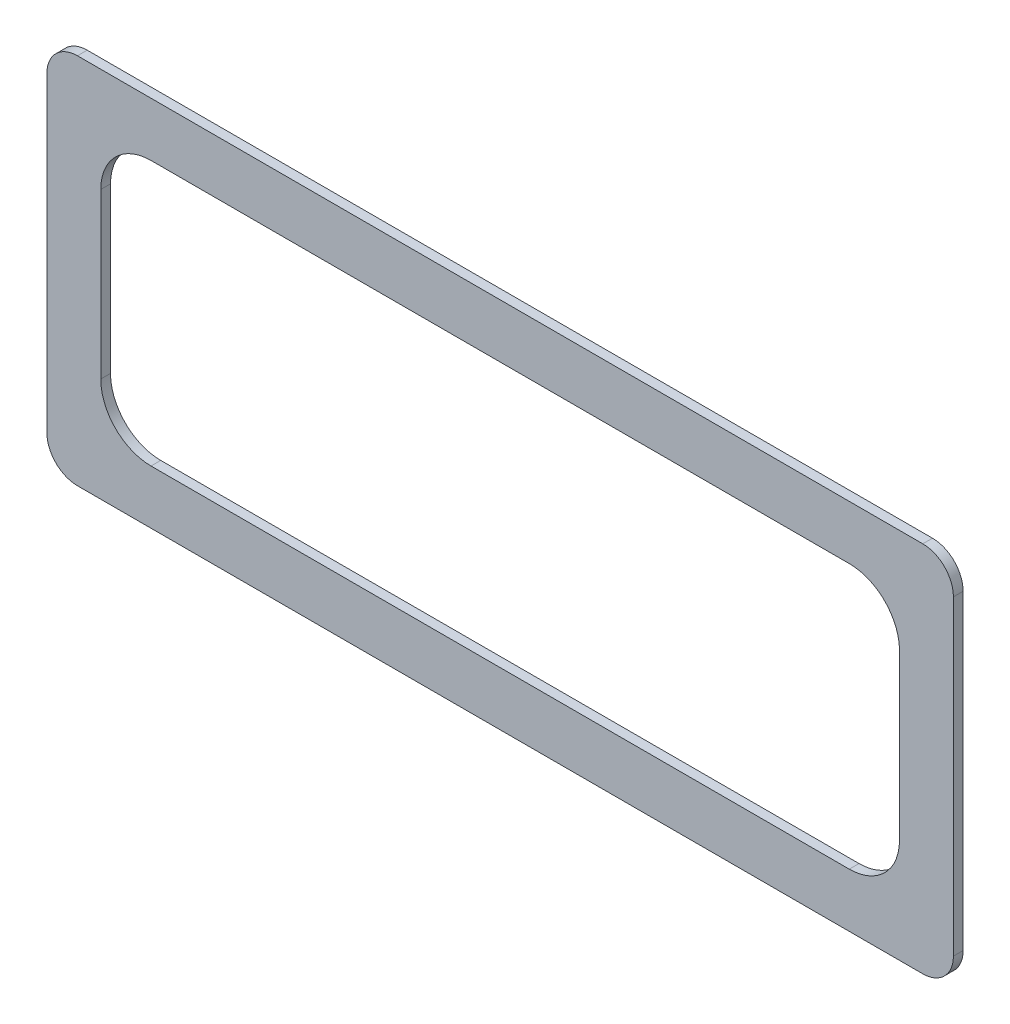
ISO-10303-21;
HEADER;
FILE_DESCRIPTION(('STEP AP214'),'2;1');
FILE_NAME('part.step','',(''),(''),'','','');
FILE_SCHEMA(('AUTOMOTIVE_DESIGN { 1 0 10303 214 1 1 1 1 }'));
ENDSEC;
DATA;
#1=APPLICATION_CONTEXT('core data for automotive mechanical design processes');
#2=APPLICATION_PROTOCOL_DEFINITION('international standard','automotive_design',2000,#1);
#3=PRODUCT_CONTEXT('',#1,'mechanical');
#4=PRODUCT('Part','Part','',(#3));
#5=PRODUCT_RELATED_PRODUCT_CATEGORY('part','',(#4));
#6=PRODUCT_DEFINITION_FORMATION('','',#4);
#7=PRODUCT_DEFINITION_CONTEXT('part definition',#1,'design');
#8=PRODUCT_DEFINITION('design','',#6,#7);
#9=PRODUCT_DEFINITION_SHAPE('','',#8);
#10=(LENGTH_UNIT() NAMED_UNIT(*) SI_UNIT(.MILLI.,.METRE.));
#11=(NAMED_UNIT(*) PLANE_ANGLE_UNIT() SI_UNIT($,.RADIAN.));
#12=(NAMED_UNIT(*) SI_UNIT($,.STERADIAN.) SOLID_ANGLE_UNIT());
#13=UNCERTAINTY_MEASURE_WITH_UNIT(LENGTH_MEASURE(1.E-05),#10,'distance_accuracy_value','');
#14=(GEOMETRIC_REPRESENTATION_CONTEXT(3) GLOBAL_UNCERTAINTY_ASSIGNED_CONTEXT((#13)) GLOBAL_UNIT_ASSIGNED_CONTEXT((#10,
#11,#12)) REPRESENTATION_CONTEXT('',''));
#15=CARTESIAN_POINT('',(0.,0.,0.));
#16=DIRECTION('',(0.,0.,1.));
#17=DIRECTION('',(1.,0.,0.));
#18=AXIS2_PLACEMENT_3D('',#15,#16,#17);
#19=CARTESIAN_POINT('',(31.5,-12.7,0.79375));
#20=DIRECTION('',(0.,0.,1.));
#21=DIRECTION('',(1.,0.,0.));
#22=AXIS2_PLACEMENT_3D('',#19,#20,#21);
#23=PLANE('',#22);
#24=CARTESIAN_POINT('',(31.5,-12.7,0.79375));
#25=DIRECTION('',(0.,0.,1.));
#26=DIRECTION('',(1.,0.,0.));
#27=AXIS2_PLACEMENT_3D('',#24,#25,#26);
#28=CIRCLE('',#27,2.50000000000001);
#29=CARTESIAN_POINT('',(31.5,-15.2,0.79375));
#30=VERTEX_POINT('',#29);
#31=CARTESIAN_POINT('',(34.,-12.7,0.79375));
#32=VERTEX_POINT('',#31);
#33=EDGE_CURVE('E215',#30,#32,#28,.T.);
#34=ORIENTED_EDGE('',*,*,#33,.T.);
#35=DIRECTION('',(0.,1.,0.));
#36=VECTOR('',#35,1.);
#37=CARTESIAN_POINT('',(34.,-12.7,0.79375));
#38=LINE('',#37,#36);
#39=CARTESIAN_POINT('',(34.,12.7,0.79375));
#40=VERTEX_POINT('',#39);
#41=EDGE_CURVE('E218',#32,#40,#38,.T.);
#42=ORIENTED_EDGE('',*,*,#41,.T.);
#43=CARTESIAN_POINT('',(31.5,12.7,0.79375));
#44=DIRECTION('',(0.,0.,1.));
#45=DIRECTION('',(1.,0.,0.));
#46=AXIS2_PLACEMENT_3D('',#43,#44,#45);
#47=CIRCLE('',#46,2.5);
#48=CARTESIAN_POINT('',(31.5,15.2,0.79375));
#49=VERTEX_POINT('',#48);
#50=EDGE_CURVE('E221',#40,#49,#47,.T.);
#51=ORIENTED_EDGE('',*,*,#50,.T.);
#52=DIRECTION('',(-1.,0.,0.));
#53=VECTOR('',#52,1.);
#54=CARTESIAN_POINT('',(31.5,15.2,0.79375));
#55=LINE('',#54,#53);
#56=CARTESIAN_POINT('',(-37.5,15.2,0.79375));
#57=VERTEX_POINT('',#56);
#58=EDGE_CURVE('E223',#49,#57,#55,.T.);
#59=ORIENTED_EDGE('',*,*,#58,.T.);
#60=CARTESIAN_POINT('',(-37.5,12.7,0.79375));
#61=DIRECTION('',(0.,0.,1.));
#62=DIRECTION('',(1.,0.,0.));
#63=AXIS2_PLACEMENT_3D('',#60,#61,#62);
#64=CIRCLE('',#63,2.5);
#65=CARTESIAN_POINT('',(-40.,12.7,0.79375));
#66=VERTEX_POINT('',#65);
#67=EDGE_CURVE('E225',#57,#66,#64,.T.);
#68=ORIENTED_EDGE('',*,*,#67,.T.);
#69=DIRECTION('',(0.,-1.,0.));
#70=VECTOR('',#69,1.);
#71=CARTESIAN_POINT('',(-40.,12.7,0.79375));
#72=LINE('',#71,#70);
#73=CARTESIAN_POINT('',(-40.,-12.7,0.79375));
#74=VERTEX_POINT('',#73);
#75=EDGE_CURVE('E227',#66,#74,#72,.T.);
#76=ORIENTED_EDGE('',*,*,#75,.T.);
#77=CARTESIAN_POINT('',(-37.5,-12.7,0.79375));
#78=DIRECTION('',(0.,0.,1.));
#79=DIRECTION('',(1.,0.,0.));
#80=AXIS2_PLACEMENT_3D('',#77,#78,#79);
#81=CIRCLE('',#80,2.5);
#82=CARTESIAN_POINT('',(-37.5,-15.2,0.79375));
#83=VERTEX_POINT('',#82);
#84=EDGE_CURVE('E229',#74,#83,#81,.T.);
#85=ORIENTED_EDGE('',*,*,#84,.T.);
#86=DIRECTION('',(1.,0.,0.));
#87=VECTOR('',#86,1.);
#88=CARTESIAN_POINT('',(-37.5,-15.2,0.79375));
#89=LINE('',#88,#87);
#90=EDGE_CURVE('E231',#83,#30,#89,.T.);
#91=ORIENTED_EDGE('',*,*,#90,.T.);
#92=EDGE_LOOP('',(#34,#42,#51,#59,#68,#76,#85,#91));
#93=FACE_BOUND('',#92,.T.);
#94=DIRECTION('',(-1.,0.,0.));
#95=VECTOR('',#94,1.);
#96=CARTESIAN_POINT('',(25.5,10.8,0.79375));
#97=LINE('',#96,#95);
#98=CARTESIAN_POINT('',(25.5,10.8,0.79375));
#99=VERTEX_POINT('',#98);
#100=CARTESIAN_POINT('',(-31.5,10.8,0.79375));
#101=VERTEX_POINT('',#100);
#102=EDGE_CURVE('E158',#99,#101,#97,.T.);
#103=ORIENTED_EDGE('',*,*,#102,.F.);
#104=CARTESIAN_POINT('',(25.5,6.7,0.79375));
#105=DIRECTION('',(0.,0.,1.));
#106=DIRECTION('',(1.,0.,0.));
#107=AXIS2_PLACEMENT_3D('',#104,#105,#106);
#108=CIRCLE('',#107,4.1);
#109=CARTESIAN_POINT('',(29.6,6.7,0.79375));
#110=VERTEX_POINT('',#109);
#111=EDGE_CURVE('E150',#110,#99,#108,.T.);
#112=ORIENTED_EDGE('',*,*,#111,.F.);
#113=DIRECTION('',(0.,1.,0.));
#114=VECTOR('',#113,1.);
#115=CARTESIAN_POINT('',(29.6,-6.7,0.79375));
#116=LINE('',#115,#114);
#117=CARTESIAN_POINT('',(29.6,-6.7,0.79375));
#118=VERTEX_POINT('',#117);
#119=EDGE_CURVE('E183',#118,#110,#116,.T.);
#120=ORIENTED_EDGE('',*,*,#119,.F.);
#121=CARTESIAN_POINT('',(25.5,-6.7,0.79375));
#122=DIRECTION('',(0.,0.,1.));
#123=DIRECTION('',(1.,0.,0.));
#124=AXIS2_PLACEMENT_3D('',#121,#122,#123);
#125=CIRCLE('',#124,4.1);
#126=CARTESIAN_POINT('',(25.5,-10.8,0.79375));
#127=VERTEX_POINT('',#126);
#128=EDGE_CURVE('E181',#127,#118,#125,.T.);
#129=ORIENTED_EDGE('',*,*,#128,.F.);
#130=DIRECTION('',(1.,0.,0.));
#131=VECTOR('',#130,1.);
#132=CARTESIAN_POINT('',(-31.5,-10.8,0.79375));
#133=LINE('',#132,#131);
#134=CARTESIAN_POINT('',(-31.5,-10.8,0.79375));
#135=VERTEX_POINT('',#134);
#136=EDGE_CURVE('E179',#135,#127,#133,.T.);
#137=ORIENTED_EDGE('',*,*,#136,.F.);
#138=CARTESIAN_POINT('',(-31.5,-6.7,0.79375));
#139=DIRECTION('',(0.,0.,1.));
#140=DIRECTION('',(1.,0.,0.));
#141=AXIS2_PLACEMENT_3D('',#138,#139,#140);
#142=CIRCLE('',#141,4.1);
#143=CARTESIAN_POINT('',(-35.6,-6.7,0.79375));
#144=VERTEX_POINT('',#143);
#145=EDGE_CURVE('E177',#144,#135,#142,.T.);
#146=ORIENTED_EDGE('',*,*,#145,.F.);
#147=DIRECTION('',(0.,-1.,0.));
#148=VECTOR('',#147,1.);
#149=CARTESIAN_POINT('',(-35.6,6.7,0.79375));
#150=LINE('',#149,#148);
#151=CARTESIAN_POINT('',(-35.6,6.7,0.79375));
#152=VERTEX_POINT('',#151);
#153=EDGE_CURVE('E173',#152,#144,#150,.T.);
#154=ORIENTED_EDGE('',*,*,#153,.F.);
#155=CARTESIAN_POINT('',(-31.5,6.7,0.79375));
#156=DIRECTION('',(0.,0.,1.));
#157=DIRECTION('',(1.,0.,0.));
#158=AXIS2_PLACEMENT_3D('',#155,#156,#157);
#159=CIRCLE('',#158,4.1);
#160=EDGE_CURVE('E171',#101,#152,#159,.T.);
#161=ORIENTED_EDGE('',*,*,#160,.F.);
#162=EDGE_LOOP('',(#103,#112,#120,#129,#137,#146,#154,#161));
#163=FACE_BOUND('',#162,.T.);
#164=ADVANCED_FACE('F37',(#93,#163),#23,.T.);
#165=CARTESIAN_POINT('',(31.5,-12.7,0.));
#166=DIRECTION('',(0.,0.,1.));
#167=DIRECTION('',(1.,0.,0.));
#168=AXIS2_PLACEMENT_3D('',#165,#166,#167);
#169=PLANE('',#168);
#170=CARTESIAN_POINT('',(31.5,-12.7,0.));
#171=DIRECTION('',(0.,0.,1.));
#172=DIRECTION('',(1.,0.,0.));
#173=AXIS2_PLACEMENT_3D('',#170,#171,#172);
#174=CIRCLE('',#173,2.50000000000001);
#175=CARTESIAN_POINT('',(31.5,-15.2,0.));
#176=VERTEX_POINT('',#175);
#177=CARTESIAN_POINT('',(34.,-12.7,0.));
#178=VERTEX_POINT('',#177);
#179=EDGE_CURVE('E166',#176,#178,#174,.T.);
#180=ORIENTED_EDGE('',*,*,#179,.F.);
#181=DIRECTION('',(1.,0.,0.));
#182=VECTOR('',#181,1.);
#183=CARTESIAN_POINT('',(-37.5,-15.2,0.));
#184=LINE('',#183,#182);
#185=CARTESIAN_POINT('',(-37.5,-15.2,0.));
#186=VERTEX_POINT('',#185);
#187=EDGE_CURVE('E219',#186,#176,#184,.T.);
#188=ORIENTED_EDGE('',*,*,#187,.F.);
#189=CARTESIAN_POINT('',(-37.5,-12.7,0.));
#190=DIRECTION('',(0.,0.,1.));
#191=DIRECTION('',(1.,0.,0.));
#192=AXIS2_PLACEMENT_3D('',#189,#190,#191);
#193=CIRCLE('',#192,2.5);
#194=CARTESIAN_POINT('',(-40.,-12.7,0.));
#195=VERTEX_POINT('',#194);
#196=EDGE_CURVE('E246',#195,#186,#193,.T.);
#197=ORIENTED_EDGE('',*,*,#196,.F.);
#198=DIRECTION('',(0.,-1.,0.));
#199=VECTOR('',#198,1.);
#200=CARTESIAN_POINT('',(-40.,12.7,0.));
#201=LINE('',#200,#199);
#202=CARTESIAN_POINT('',(-40.,12.7,0.));
#203=VERTEX_POINT('',#202);
#204=EDGE_CURVE('E244',#203,#195,#201,.T.);
#205=ORIENTED_EDGE('',*,*,#204,.F.);
#206=CARTESIAN_POINT('',(-37.5,12.7,0.));
#207=DIRECTION('',(0.,0.,1.));
#208=DIRECTION('',(1.,0.,0.));
#209=AXIS2_PLACEMENT_3D('',#206,#207,#208);
#210=CIRCLE('',#209,2.5);
#211=CARTESIAN_POINT('',(-37.5,15.2,0.));
#212=VERTEX_POINT('',#211);
#213=EDGE_CURVE('E242',#212,#203,#210,.T.);
#214=ORIENTED_EDGE('',*,*,#213,.F.);
#215=DIRECTION('',(-1.,0.,0.));
#216=VECTOR('',#215,1.);
#217=CARTESIAN_POINT('',(31.5,15.2,0.));
#218=LINE('',#217,#216);
#219=CARTESIAN_POINT('',(31.5,15.2,0.));
#220=VERTEX_POINT('',#219);
#221=EDGE_CURVE('E240',#220,#212,#218,.T.);
#222=ORIENTED_EDGE('',*,*,#221,.F.);
#223=CARTESIAN_POINT('',(31.5,12.7,0.));
#224=DIRECTION('',(0.,0.,1.));
#225=DIRECTION('',(1.,0.,0.));
#226=AXIS2_PLACEMENT_3D('',#223,#224,#225);
#227=CIRCLE('',#226,2.5);
#228=CARTESIAN_POINT('',(34.,12.7,0.));
#229=VERTEX_POINT('',#228);
#230=EDGE_CURVE('E238',#229,#220,#227,.T.);
#231=ORIENTED_EDGE('',*,*,#230,.F.);
#232=DIRECTION('',(0.,1.,0.));
#233=VECTOR('',#232,1.);
#234=CARTESIAN_POINT('',(34.,-12.7,0.));
#235=LINE('',#234,#233);
#236=EDGE_CURVE('E236',#178,#229,#235,.T.);
#237=ORIENTED_EDGE('',*,*,#236,.F.);
#238=EDGE_LOOP('',(#180,#188,#197,#205,#214,#222,#231,#237));
#239=FACE_BOUND('',#238,.T.);
#240=CARTESIAN_POINT('',(25.5,6.7,0.));
#241=DIRECTION('',(0.,0.,1.));
#242=DIRECTION('',(1.,0.,0.));
#243=AXIS2_PLACEMENT_3D('',#240,#241,#242);
#244=CIRCLE('',#243,4.1);
#245=CARTESIAN_POINT('',(29.6,6.7,0.));
#246=VERTEX_POINT('',#245);
#247=CARTESIAN_POINT('',(25.5,10.8,0.));
#248=VERTEX_POINT('',#247);
#249=EDGE_CURVE('E60',#246,#248,#244,.T.);
#250=ORIENTED_EDGE('',*,*,#249,.T.);
#251=DIRECTION('',(-1.,0.,0.));
#252=VECTOR('',#251,1.);
#253=CARTESIAN_POINT('',(25.5,10.8,0.));
#254=LINE('',#253,#252);
#255=CARTESIAN_POINT('',(-31.5,10.8,0.));
#256=VERTEX_POINT('',#255);
#257=EDGE_CURVE('E165',#248,#256,#254,.T.);
#258=ORIENTED_EDGE('',*,*,#257,.T.);
#259=CARTESIAN_POINT('',(-31.5,6.7,0.));
#260=DIRECTION('',(0.,0.,1.));
#261=DIRECTION('',(1.,0.,0.));
#262=AXIS2_PLACEMENT_3D('',#259,#260,#261);
#263=CIRCLE('',#262,4.1);
#264=CARTESIAN_POINT('',(-35.6,6.7,0.));
#265=VERTEX_POINT('',#264);
#266=EDGE_CURVE('E187',#256,#265,#263,.T.);
#267=ORIENTED_EDGE('',*,*,#266,.T.);
#268=DIRECTION('',(0.,-1.,0.));
#269=VECTOR('',#268,1.);
#270=CARTESIAN_POINT('',(-35.6,6.7,0.));
#271=LINE('',#270,#269);
#272=CARTESIAN_POINT('',(-35.6,-6.7,0.));
#273=VERTEX_POINT('',#272);
#274=EDGE_CURVE('E190',#265,#273,#271,.T.);
#275=ORIENTED_EDGE('',*,*,#274,.T.);
#276=CARTESIAN_POINT('',(-31.5,-6.7,0.));
#277=DIRECTION('',(0.,0.,1.));
#278=DIRECTION('',(1.,0.,0.));
#279=AXIS2_PLACEMENT_3D('',#276,#277,#278);
#280=CIRCLE('',#279,4.1);
#281=CARTESIAN_POINT('',(-31.5,-10.8,0.));
#282=VERTEX_POINT('',#281);
#283=EDGE_CURVE('E193',#273,#282,#280,.T.);
#284=ORIENTED_EDGE('',*,*,#283,.T.);
#285=DIRECTION('',(1.,0.,0.));
#286=VECTOR('',#285,1.);
#287=CARTESIAN_POINT('',(-31.5,-10.8,0.));
#288=LINE('',#287,#286);
#289=CARTESIAN_POINT('',(25.5,-10.8,0.));
#290=VERTEX_POINT('',#289);
#291=EDGE_CURVE('E196',#282,#290,#288,.T.);
#292=ORIENTED_EDGE('',*,*,#291,.T.);
#293=CARTESIAN_POINT('',(25.5,-6.7,0.));
#294=DIRECTION('',(0.,0.,1.));
#295=DIRECTION('',(1.,0.,0.));
#296=AXIS2_PLACEMENT_3D('',#293,#294,#295);
#297=CIRCLE('',#296,4.1);
#298=CARTESIAN_POINT('',(29.6,-6.7,0.));
#299=VERTEX_POINT('',#298);
#300=EDGE_CURVE('E199',#290,#299,#297,.T.);
#301=ORIENTED_EDGE('',*,*,#300,.T.);
#302=DIRECTION('',(0.,1.,0.));
#303=VECTOR('',#302,1.);
#304=CARTESIAN_POINT('',(29.6,-6.7,0.));
#305=LINE('',#304,#303);
#306=EDGE_CURVE('E159',#299,#246,#305,.T.);
#307=ORIENTED_EDGE('',*,*,#306,.T.);
#308=EDGE_LOOP('',(#250,#258,#267,#275,#284,#292,#301,#307));
#309=FACE_BOUND('',#308,.T.);
#310=ADVANCED_FACE('F276',(#239,#309),#169,.F.);
#311=CARTESIAN_POINT('',(31.5,-12.7,0.79375));
#312=DIRECTION('',(0.,0.,-1.));
#313=DIRECTION('',(-1.,0.,0.));
#314=AXIS2_PLACEMENT_3D('',#311,#312,#313);
#315=CYLINDRICAL_SURFACE('',#314,2.50000000000001);
#316=ORIENTED_EDGE('',*,*,#179,.T.);
#317=DIRECTION('',(0.,0.,-1.));
#318=VECTOR('',#317,1.);
#319=CARTESIAN_POINT('',(34.,-12.7,0.79375));
#320=LINE('',#319,#318);
#321=EDGE_CURVE('E11',#32,#178,#320,.T.);
#322=ORIENTED_EDGE('',*,*,#321,.F.);
#323=ORIENTED_EDGE('',*,*,#33,.F.);
#324=DIRECTION('',(0.,0.,-1.));
#325=VECTOR('',#324,1.);
#326=CARTESIAN_POINT('',(31.5,-15.2,0.79375));
#327=LINE('',#326,#325);
#328=EDGE_CURVE('E233',#30,#176,#327,.T.);
#329=ORIENTED_EDGE('',*,*,#328,.T.);
#330=EDGE_LOOP('',(#316,#322,#323,#329));
#331=FACE_BOUND('',#330,.T.);
#332=ADVANCED_FACE('F39',(#331),#315,.T.);
#333=CARTESIAN_POINT('',(34.,-12.7,0.79375));
#334=DIRECTION('',(-1.,0.,0.));
#335=DIRECTION('',(0.,-1.,0.));
#336=AXIS2_PLACEMENT_3D('',#333,#334,#335);
#337=PLANE('',#336);
#338=ORIENTED_EDGE('',*,*,#236,.T.);
#339=DIRECTION('',(0.,0.,-1.));
#340=VECTOR('',#339,1.);
#341=CARTESIAN_POINT('',(34.,12.7,0.79375));
#342=LINE('',#341,#340);
#343=EDGE_CURVE('E45',#40,#229,#342,.T.);
#344=ORIENTED_EDGE('',*,*,#343,.F.);
#345=ORIENTED_EDGE('',*,*,#41,.F.);
#346=ORIENTED_EDGE('',*,*,#321,.T.);
#347=EDGE_LOOP('',(#338,#344,#345,#346));
#348=FACE_BOUND('',#347,.T.);
#349=ADVANCED_FACE('F293',(#348),#337,.F.);
#350=CARTESIAN_POINT('',(31.5,12.7,0.79375));
#351=DIRECTION('',(0.,0.,-1.));
#352=DIRECTION('',(-1.,0.,0.));
#353=AXIS2_PLACEMENT_3D('',#350,#351,#352);
#354=CYLINDRICAL_SURFACE('',#353,2.5);
#355=ORIENTED_EDGE('',*,*,#230,.T.);
#356=DIRECTION('',(0.,0.,-1.));
#357=VECTOR('',#356,1.);
#358=CARTESIAN_POINT('',(31.5,15.2,0.79375));
#359=LINE('',#358,#357);
#360=EDGE_CURVE('E263',#49,#220,#359,.T.);
#361=ORIENTED_EDGE('',*,*,#360,.F.);
#362=ORIENTED_EDGE('',*,*,#50,.F.);
#363=ORIENTED_EDGE('',*,*,#343,.T.);
#364=EDGE_LOOP('',(#355,#361,#362,#363));
#365=FACE_BOUND('',#364,.T.);
#366=ADVANCED_FACE('F270',(#365),#354,.T.);
#367=CARTESIAN_POINT('',(31.5,15.2,0.79375));
#368=DIRECTION('',(0.,-1.,0.));
#369=DIRECTION('',(1.,0.,0.));
#370=AXIS2_PLACEMENT_3D('',#367,#368,#369);
#371=PLANE('',#370);
#372=ORIENTED_EDGE('',*,*,#221,.T.);
#373=DIRECTION('',(0.,0.,-1.));
#374=VECTOR('',#373,1.);
#375=CARTESIAN_POINT('',(-37.5,15.2,0.79375));
#376=LINE('',#375,#374);
#377=EDGE_CURVE('E260',#57,#212,#376,.T.);
#378=ORIENTED_EDGE('',*,*,#377,.F.);
#379=ORIENTED_EDGE('',*,*,#58,.F.);
#380=ORIENTED_EDGE('',*,*,#360,.T.);
#381=EDGE_LOOP('',(#372,#378,#379,#380));
#382=FACE_BOUND('',#381,.T.);
#383=ADVANCED_FACE('F282',(#382),#371,.F.);
#384=CARTESIAN_POINT('',(-37.5,12.7,0.79375));
#385=DIRECTION('',(0.,0.,-1.));
#386=DIRECTION('',(-1.,0.,0.));
#387=AXIS2_PLACEMENT_3D('',#384,#385,#386);
#388=CYLINDRICAL_SURFACE('',#387,2.5);
#389=ORIENTED_EDGE('',*,*,#213,.T.);
#390=DIRECTION('',(0.,0.,-1.));
#391=VECTOR('',#390,1.);
#392=CARTESIAN_POINT('',(-40.,12.7,0.79375));
#393=LINE('',#392,#391);
#394=EDGE_CURVE('E257',#66,#203,#393,.T.);
#395=ORIENTED_EDGE('',*,*,#394,.F.);
#396=ORIENTED_EDGE('',*,*,#67,.F.);
#397=ORIENTED_EDGE('',*,*,#377,.T.);
#398=EDGE_LOOP('',(#389,#395,#396,#397));
#399=FACE_BOUND('',#398,.T.);
#400=ADVANCED_FACE('F286',(#399),#388,.T.);
#401=CARTESIAN_POINT('',(-40.,12.7,0.79375));
#402=DIRECTION('',(1.,0.,0.));
#403=DIRECTION('',(0.,1.,0.));
#404=AXIS2_PLACEMENT_3D('',#401,#402,#403);
#405=PLANE('',#404);
#406=ORIENTED_EDGE('',*,*,#204,.T.);
#407=DIRECTION('',(0.,0.,-1.));
#408=VECTOR('',#407,1.);
#409=CARTESIAN_POINT('',(-40.,-12.7,0.79375));
#410=LINE('',#409,#408);
#411=EDGE_CURVE('E254',#74,#195,#410,.T.);
#412=ORIENTED_EDGE('',*,*,#411,.F.);
#413=ORIENTED_EDGE('',*,*,#75,.F.);
#414=ORIENTED_EDGE('',*,*,#394,.T.);
#415=EDGE_LOOP('',(#406,#412,#413,#414));
#416=FACE_BOUND('',#415,.T.);
#417=ADVANCED_FACE('F306',(#416),#405,.F.);
#418=CARTESIAN_POINT('',(-37.5,-12.7,0.79375));
#419=DIRECTION('',(0.,0.,-1.));
#420=DIRECTION('',(-1.,0.,0.));
#421=AXIS2_PLACEMENT_3D('',#418,#419,#420);
#422=CYLINDRICAL_SURFACE('',#421,2.5);
#423=ORIENTED_EDGE('',*,*,#196,.T.);
#424=DIRECTION('',(0.,0.,-1.));
#425=VECTOR('',#424,1.);
#426=CARTESIAN_POINT('',(-37.5,-15.2,0.79375));
#427=LINE('',#426,#425);
#428=EDGE_CURVE('E251',#83,#186,#427,.T.);
#429=ORIENTED_EDGE('',*,*,#428,.F.);
#430=ORIENTED_EDGE('',*,*,#84,.F.);
#431=ORIENTED_EDGE('',*,*,#411,.T.);
#432=EDGE_LOOP('',(#423,#429,#430,#431));
#433=FACE_BOUND('',#432,.T.);
#434=ADVANCED_FACE('F304',(#433),#422,.T.);
#435=CARTESIAN_POINT('',(-37.5,-15.2,0.79375));
#436=DIRECTION('',(0.,1.,0.));
#437=DIRECTION('',(-1.,0.,0.));
#438=AXIS2_PLACEMENT_3D('',#435,#436,#437);
#439=PLANE('',#438);
#440=ORIENTED_EDGE('',*,*,#187,.T.);
#441=ORIENTED_EDGE('',*,*,#328,.F.);
#442=ORIENTED_EDGE('',*,*,#90,.F.);
#443=ORIENTED_EDGE('',*,*,#428,.T.);
#444=EDGE_LOOP('',(#440,#441,#442,#443));
#445=FACE_BOUND('',#444,.T.);
#446=ADVANCED_FACE('F299',(#445),#439,.F.);
#447=CARTESIAN_POINT('',(25.5,6.7,0.79375));
#448=DIRECTION('',(0.,0.,-1.));
#449=DIRECTION('',(-1.,0.,0.));
#450=AXIS2_PLACEMENT_3D('',#447,#448,#449);
#451=CYLINDRICAL_SURFACE('',#450,4.1);
#452=ORIENTED_EDGE('',*,*,#249,.F.);
#453=DIRECTION('',(0.,0.,-1.));
#454=VECTOR('',#453,1.);
#455=CARTESIAN_POINT('',(29.6,6.7,0.79375));
#456=LINE('',#455,#454);
#457=EDGE_CURVE('E154',#110,#246,#456,.T.);
#458=ORIENTED_EDGE('',*,*,#457,.F.);
#459=ORIENTED_EDGE('',*,*,#111,.T.);
#460=DIRECTION('',(0.,0.,-1.));
#461=VECTOR('',#460,1.);
#462=CARTESIAN_POINT('',(25.5,10.8,0.79375));
#463=LINE('',#462,#461);
#464=EDGE_CURVE('E153',#99,#248,#463,.T.);
#465=ORIENTED_EDGE('',*,*,#464,.T.);
#466=EDGE_LOOP('',(#452,#458,#459,#465));
#467=FACE_BOUND('',#466,.T.);
#468=ADVANCED_FACE('F152',(#467),#451,.F.);
#469=CARTESIAN_POINT('',(25.5,10.8,0.79375));
#470=DIRECTION('',(0.,-1.,0.));
#471=DIRECTION('',(1.,0.,0.));
#472=AXIS2_PLACEMENT_3D('',#469,#470,#471);
#473=PLANE('',#472);
#474=ORIENTED_EDGE('',*,*,#257,.F.);
#475=ORIENTED_EDGE('',*,*,#464,.F.);
#476=ORIENTED_EDGE('',*,*,#102,.T.);
#477=DIRECTION('',(0.,0.,-1.));
#478=VECTOR('',#477,1.);
#479=CARTESIAN_POINT('',(-31.5,10.8,0.79375));
#480=LINE('',#479,#478);
#481=EDGE_CURVE('E167',#101,#256,#480,.T.);
#482=ORIENTED_EDGE('',*,*,#481,.T.);
#483=EDGE_LOOP('',(#474,#475,#476,#482));
#484=FACE_BOUND('',#483,.T.);
#485=ADVANCED_FACE('F162',(#484),#473,.T.);
#486=CARTESIAN_POINT('',(-31.5,6.7,0.79375));
#487=DIRECTION('',(0.,0.,-1.));
#488=DIRECTION('',(-1.,0.,0.));
#489=AXIS2_PLACEMENT_3D('',#486,#487,#488);
#490=CYLINDRICAL_SURFACE('',#489,4.1);
#491=ORIENTED_EDGE('',*,*,#266,.F.);
#492=ORIENTED_EDGE('',*,*,#481,.F.);
#493=ORIENTED_EDGE('',*,*,#160,.T.);
#494=DIRECTION('',(0.,0.,-1.));
#495=VECTOR('',#494,1.);
#496=CARTESIAN_POINT('',(-35.6,6.7,0.79375));
#497=LINE('',#496,#495);
#498=EDGE_CURVE('E212',#152,#265,#497,.T.);
#499=ORIENTED_EDGE('',*,*,#498,.T.);
#500=EDGE_LOOP('',(#491,#492,#493,#499));
#501=FACE_BOUND('',#500,.T.);
#502=ADVANCED_FACE('F331',(#501),#490,.F.);
#503=CARTESIAN_POINT('',(-35.6,6.7,0.79375));
#504=DIRECTION('',(1.,0.,0.));
#505=DIRECTION('',(0.,0.,-1.));
#506=AXIS2_PLACEMENT_3D('',#503,#504,#505);
#507=PLANE('',#506);
#508=ORIENTED_EDGE('',*,*,#274,.F.);
#509=ORIENTED_EDGE('',*,*,#498,.F.);
#510=ORIENTED_EDGE('',*,*,#153,.T.);
#511=DIRECTION('',(0.,0.,-1.));
#512=VECTOR('',#511,1.);
#513=CARTESIAN_POINT('',(-35.6,-6.7,0.79375));
#514=LINE('',#513,#512);
#515=EDGE_CURVE('E210',#144,#273,#514,.T.);
#516=ORIENTED_EDGE('',*,*,#515,.T.);
#517=EDGE_LOOP('',(#508,#509,#510,#516));
#518=FACE_BOUND('',#517,.T.);
#519=ADVANCED_FACE('F335',(#518),#507,.T.);
#520=CARTESIAN_POINT('',(-31.5,-6.7,0.79375));
#521=DIRECTION('',(0.,0.,-1.));
#522=DIRECTION('',(-1.,0.,0.));
#523=AXIS2_PLACEMENT_3D('',#520,#521,#522);
#524=CYLINDRICAL_SURFACE('',#523,4.1);
#525=ORIENTED_EDGE('',*,*,#283,.F.);
#526=ORIENTED_EDGE('',*,*,#515,.F.);
#527=ORIENTED_EDGE('',*,*,#145,.T.);
#528=DIRECTION('',(0.,0.,-1.));
#529=VECTOR('',#528,1.);
#530=CARTESIAN_POINT('',(-31.5,-10.8,0.79375));
#531=LINE('',#530,#529);
#532=EDGE_CURVE('E208',#135,#282,#531,.T.);
#533=ORIENTED_EDGE('',*,*,#532,.T.);
#534=EDGE_LOOP('',(#525,#526,#527,#533));
#535=FACE_BOUND('',#534,.T.);
#536=ADVANCED_FACE('F341',(#535),#524,.F.);
#537=CARTESIAN_POINT('',(-31.5,-10.8,0.79375));
#538=DIRECTION('',(0.,1.,0.));
#539=DIRECTION('',(0.,0.,1.));
#540=AXIS2_PLACEMENT_3D('',#537,#538,#539);
#541=PLANE('',#540);
#542=ORIENTED_EDGE('',*,*,#291,.F.);
#543=ORIENTED_EDGE('',*,*,#532,.F.);
#544=ORIENTED_EDGE('',*,*,#136,.T.);
#545=DIRECTION('',(0.,0.,-1.));
#546=VECTOR('',#545,1.);
#547=CARTESIAN_POINT('',(25.5,-10.8,0.79375));
#548=LINE('',#547,#546);
#549=EDGE_CURVE('E206',#127,#290,#548,.T.);
#550=ORIENTED_EDGE('',*,*,#549,.T.);
#551=EDGE_LOOP('',(#542,#543,#544,#550));
#552=FACE_BOUND('',#551,.T.);
#553=ADVANCED_FACE('F345',(#552),#541,.T.);
#554=CARTESIAN_POINT('',(25.5,-6.7,0.79375));
#555=DIRECTION('',(0.,0.,-1.));
#556=DIRECTION('',(-1.,0.,0.));
#557=AXIS2_PLACEMENT_3D('',#554,#555,#556);
#558=CYLINDRICAL_SURFACE('',#557,4.1);
#559=ORIENTED_EDGE('',*,*,#300,.F.);
#560=ORIENTED_EDGE('',*,*,#549,.F.);
#561=ORIENTED_EDGE('',*,*,#128,.T.);
#562=DIRECTION('',(0.,0.,-1.));
#563=VECTOR('',#562,1.);
#564=CARTESIAN_POINT('',(29.6,-6.7,0.79375));
#565=LINE('',#564,#563);
#566=EDGE_CURVE('E52',#118,#299,#565,.T.);
#567=ORIENTED_EDGE('',*,*,#566,.T.);
#568=EDGE_LOOP('',(#559,#560,#561,#567));
#569=FACE_BOUND('',#568,.T.);
#570=ADVANCED_FACE('F349',(#569),#558,.F.);
#571=CARTESIAN_POINT('',(29.6,-6.7,0.79375));
#572=DIRECTION('',(-1.,0.,0.));
#573=DIRECTION('',(0.,0.,1.));
#574=AXIS2_PLACEMENT_3D('',#571,#572,#573);
#575=PLANE('',#574);
#576=ORIENTED_EDGE('',*,*,#306,.F.);
#577=ORIENTED_EDGE('',*,*,#566,.F.);
#578=ORIENTED_EDGE('',*,*,#119,.T.);
#579=ORIENTED_EDGE('',*,*,#457,.T.);
#580=EDGE_LOOP('',(#576,#577,#578,#579));
#581=FACE_BOUND('',#580,.T.);
#582=ADVANCED_FACE('F353',(#581),#575,.T.);
#583=CLOSED_SHELL('',(#164,#310,#332,#349,#366,#383,#400,#417,#434,#446,#468,#485,#502,#519,
#536,#553,#570,#582));
#584=MANIFOLD_SOLID_BREP('B2',#583);
#585=ADVANCED_BREP_SHAPE_REPRESENTATION('',(#18,#584),#14);
#586=SHAPE_DEFINITION_REPRESENTATION(#9,#585);
ENDSEC;
END-ISO-10303-21;
